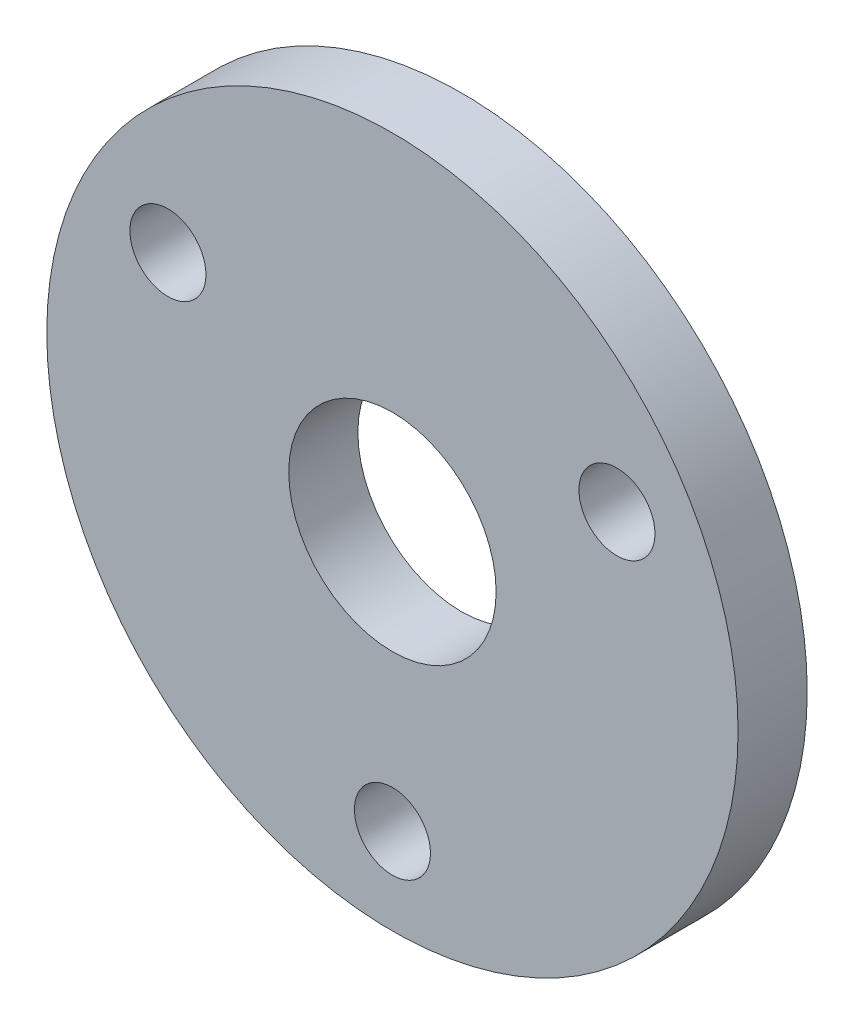
ISO-10303-21;
HEADER;
FILE_DESCRIPTION(('STEP AP214'),'2;1');
FILE_NAME('part.step','',(''),(''),'','','');
FILE_SCHEMA(('AUTOMOTIVE_DESIGN { 1 0 10303 214 1 1 1 1 }'));
ENDSEC;
DATA;
#1=APPLICATION_CONTEXT('core data for automotive mechanical design processes');
#2=APPLICATION_PROTOCOL_DEFINITION('international standard','automotive_design',2000,#1);
#3=PRODUCT_CONTEXT('',#1,'mechanical');
#4=PRODUCT('Part','Part','',(#3));
#5=PRODUCT_RELATED_PRODUCT_CATEGORY('part','',(#4));
#6=PRODUCT_DEFINITION_FORMATION('','',#4);
#7=PRODUCT_DEFINITION_CONTEXT('part definition',#1,'design');
#8=PRODUCT_DEFINITION('design','',#6,#7);
#9=PRODUCT_DEFINITION_SHAPE('','',#8);
#10=(LENGTH_UNIT() NAMED_UNIT(*) SI_UNIT(.MILLI.,.METRE.));
#11=(NAMED_UNIT(*) PLANE_ANGLE_UNIT() SI_UNIT($,.RADIAN.));
#12=(NAMED_UNIT(*) SI_UNIT($,.STERADIAN.) SOLID_ANGLE_UNIT());
#13=UNCERTAINTY_MEASURE_WITH_UNIT(LENGTH_MEASURE(1.E-05),#10,'distance_accuracy_value','');
#14=(GEOMETRIC_REPRESENTATION_CONTEXT(3) GLOBAL_UNCERTAINTY_ASSIGNED_CONTEXT((#13)) GLOBAL_UNIT_ASSIGNED_CONTEXT((#10,
#11,#12)) REPRESENTATION_CONTEXT('',''));
#15=CARTESIAN_POINT('',(0.,0.,0.));
#16=DIRECTION('',(0.,0.,1.));
#17=DIRECTION('',(1.,0.,0.));
#18=AXIS2_PLACEMENT_3D('',#15,#16,#17);
#19=CARTESIAN_POINT('',(0.,0.,2.));
#20=DIRECTION('',(0.,0.,1.));
#21=DIRECTION('',(1.,0.,0.));
#22=AXIS2_PLACEMENT_3D('',#19,#20,#21);
#23=PLANE('',#22);
#24=CARTESIAN_POINT('',(-6.49519052838322,3.75000000000012,2.));
#25=DIRECTION('',(0.,0.,1.));
#26=DIRECTION('',(1.,0.,0.));
#27=AXIS2_PLACEMENT_3D('',#24,#25,#26);
#28=CIRCLE('',#27,1.1);
#29=CARTESIAN_POINT('',(-5.39519052838322,3.75000000000012,2.));
#30=VERTEX_POINT('',#29);
#31=EDGE_CURVE('E55',#30,#30,#28,.T.);
#32=ORIENTED_EDGE('',*,*,#31,.F.);
#33=EDGE_LOOP('',(#32));
#34=FACE_BOUND('',#33,.T.);
#35=CARTESIAN_POINT('',(0.,0.,2.));
#36=DIRECTION('',(0.,0.,1.));
#37=DIRECTION('',(1.,0.,0.));
#38=AXIS2_PLACEMENT_3D('',#35,#36,#37);
#39=CIRCLE('',#38,3.);
#40=CARTESIAN_POINT('',(3.,0.,2.));
#41=VERTEX_POINT('',#40);
#42=EDGE_CURVE('E44',#41,#41,#39,.T.);
#43=ORIENTED_EDGE('',*,*,#42,.F.);
#44=EDGE_LOOP('',(#43));
#45=FACE_BOUND('',#44,.T.);
#46=CARTESIAN_POINT('',(0.,0.,2.));
#47=DIRECTION('',(0.,0.,1.));
#48=DIRECTION('',(1.,0.,0.));
#49=AXIS2_PLACEMENT_3D('',#46,#47,#48);
#50=CIRCLE('',#49,10.);
#51=CARTESIAN_POINT('',(10.,0.,2.));
#52=VERTEX_POINT('',#51);
#53=EDGE_CURVE('E10',#52,#52,#50,.T.);
#54=ORIENTED_EDGE('',*,*,#53,.T.);
#55=EDGE_LOOP('',(#54));
#56=FACE_BOUND('',#55,.T.);
#57=CARTESIAN_POINT('',(0.,-7.5,2.));
#58=DIRECTION('',(0.,0.,1.));
#59=DIRECTION('',(1.,0.,0.));
#60=AXIS2_PLACEMENT_3D('',#57,#58,#59);
#61=CIRCLE('',#60,1.1);
#62=CARTESIAN_POINT('',(1.1,-7.5,2.));
#63=VERTEX_POINT('',#62);
#64=EDGE_CURVE('E49',#63,#63,#61,.T.);
#65=ORIENTED_EDGE('',*,*,#64,.F.);
#66=EDGE_LOOP('',(#65));
#67=FACE_BOUND('',#66,.T.);
#68=CARTESIAN_POINT('',(6.49519052838338,3.74999999999985,2.));
#69=DIRECTION('',(0.,0.,1.));
#70=DIRECTION('',(1.,0.,0.));
#71=AXIS2_PLACEMENT_3D('',#68,#69,#70);
#72=CIRCLE('',#71,1.1);
#73=CARTESIAN_POINT('',(7.59519052838338,3.74999999999985,2.));
#74=VERTEX_POINT('',#73);
#75=EDGE_CURVE('E61',#74,#74,#72,.T.);
#76=ORIENTED_EDGE('',*,*,#75,.F.);
#77=EDGE_LOOP('',(#76));
#78=FACE_BOUND('',#77,.T.);
#79=ADVANCED_FACE('F33',(#34,#45,#56,#67,#78),#23,.T.);
#80=CARTESIAN_POINT('',(0.,0.,0.));
#81=DIRECTION('',(0.,0.,1.));
#82=DIRECTION('',(1.,0.,0.));
#83=AXIS2_PLACEMENT_3D('',#80,#81,#82);
#84=PLANE('',#83);
#85=CARTESIAN_POINT('',(0.,0.,0.));
#86=DIRECTION('',(0.,0.,1.));
#87=DIRECTION('',(1.,0.,0.));
#88=AXIS2_PLACEMENT_3D('',#85,#86,#87);
#89=CIRCLE('',#88,10.);
#90=CARTESIAN_POINT('',(10.,0.,0.));
#91=VERTEX_POINT('',#90);
#92=EDGE_CURVE('E37',#91,#91,#89,.T.);
#93=ORIENTED_EDGE('',*,*,#92,.F.);
#94=EDGE_LOOP('',(#93));
#95=FACE_BOUND('',#94,.T.);
#96=CARTESIAN_POINT('',(0.,0.,0.));
#97=DIRECTION('',(0.,0.,1.));
#98=DIRECTION('',(1.,0.,0.));
#99=AXIS2_PLACEMENT_3D('',#96,#97,#98);
#100=CIRCLE('',#99,3.);
#101=CARTESIAN_POINT('',(3.,0.,0.));
#102=VERTEX_POINT('',#101);
#103=EDGE_CURVE('E46',#102,#102,#100,.T.);
#104=ORIENTED_EDGE('',*,*,#103,.T.);
#105=EDGE_LOOP('',(#104));
#106=FACE_BOUND('',#105,.T.);
#107=CARTESIAN_POINT('',(0.,-7.5,0.));
#108=DIRECTION('',(0.,0.,1.));
#109=DIRECTION('',(1.,0.,0.));
#110=AXIS2_PLACEMENT_3D('',#107,#108,#109);
#111=CIRCLE('',#110,1.1);
#112=CARTESIAN_POINT('',(1.1,-7.5,0.));
#113=VERTEX_POINT('',#112);
#114=EDGE_CURVE('E52',#113,#113,#111,.T.);
#115=ORIENTED_EDGE('',*,*,#114,.T.);
#116=EDGE_LOOP('',(#115));
#117=FACE_BOUND('',#116,.T.);
#118=CARTESIAN_POINT('',(-6.49519052838322,3.75000000000012,0.));
#119=DIRECTION('',(0.,0.,1.));
#120=DIRECTION('',(1.,0.,0.));
#121=AXIS2_PLACEMENT_3D('',#118,#119,#120);
#122=CIRCLE('',#121,1.1);
#123=CARTESIAN_POINT('',(-5.39519052838322,3.75000000000012,0.));
#124=VERTEX_POINT('',#123);
#125=EDGE_CURVE('E58',#124,#124,#122,.T.);
#126=ORIENTED_EDGE('',*,*,#125,.T.);
#127=EDGE_LOOP('',(#126));
#128=FACE_BOUND('',#127,.T.);
#129=CARTESIAN_POINT('',(6.49519052838338,3.74999999999985,0.));
#130=DIRECTION('',(0.,0.,1.));
#131=DIRECTION('',(1.,0.,0.));
#132=AXIS2_PLACEMENT_3D('',#129,#130,#131);
#133=CIRCLE('',#132,1.1);
#134=CARTESIAN_POINT('',(7.59519052838338,3.74999999999985,0.));
#135=VERTEX_POINT('',#134);
#136=EDGE_CURVE('E64',#135,#135,#133,.T.);
#137=ORIENTED_EDGE('',*,*,#136,.T.);
#138=EDGE_LOOP('',(#137));
#139=FACE_BOUND('',#138,.T.);
#140=ADVANCED_FACE('F74',(#95,#106,#117,#128,#139),#84,.F.);
#141=CARTESIAN_POINT('',(0.,0.,2.));
#142=DIRECTION('',(0.,0.,-1.));
#143=DIRECTION('',(-1.,0.,0.));
#144=AXIS2_PLACEMENT_3D('',#141,#142,#143);
#145=CYLINDRICAL_SURFACE('',#144,10.);
#146=ORIENTED_EDGE('',*,*,#53,.F.);
#147=EDGE_LOOP('',(#146));
#148=FACE_BOUND('',#147,.T.);
#149=ORIENTED_EDGE('',*,*,#92,.T.);
#150=EDGE_LOOP('',(#149));
#151=FACE_BOUND('',#150,.T.);
#152=ADVANCED_FACE('F35',(#148,#151),#145,.T.);
#153=CARTESIAN_POINT('',(0.,0.,2.));
#154=DIRECTION('',(0.,0.,-1.));
#155=DIRECTION('',(-1.,0.,0.));
#156=AXIS2_PLACEMENT_3D('',#153,#154,#155);
#157=CYLINDRICAL_SURFACE('',#156,3.);
#158=ORIENTED_EDGE('',*,*,#42,.T.);
#159=EDGE_LOOP('',(#158));
#160=FACE_BOUND('',#159,.T.);
#161=ORIENTED_EDGE('',*,*,#103,.F.);
#162=EDGE_LOOP('',(#161));
#163=FACE_BOUND('',#162,.T.);
#164=ADVANCED_FACE('F84',(#160,#163),#157,.F.);
#165=CARTESIAN_POINT('',(0.,-7.5,2.));
#166=DIRECTION('',(0.,0.,-1.));
#167=DIRECTION('',(-1.,0.,0.));
#168=AXIS2_PLACEMENT_3D('',#165,#166,#167);
#169=CYLINDRICAL_SURFACE('',#168,1.1);
#170=ORIENTED_EDGE('',*,*,#64,.T.);
#171=EDGE_LOOP('',(#170));
#172=FACE_BOUND('',#171,.T.);
#173=ORIENTED_EDGE('',*,*,#114,.F.);
#174=EDGE_LOOP('',(#173));
#175=FACE_BOUND('',#174,.T.);
#176=ADVANCED_FACE('F87',(#172,#175),#169,.F.);
#177=CARTESIAN_POINT('',(-6.49519052838322,3.75000000000012,2.));
#178=DIRECTION('',(0.,0.,-1.));
#179=DIRECTION('',(-1.,0.,0.));
#180=AXIS2_PLACEMENT_3D('',#177,#178,#179);
#181=CYLINDRICAL_SURFACE('',#180,1.1);
#182=ORIENTED_EDGE('',*,*,#31,.T.);
#183=EDGE_LOOP('',(#182));
#184=FACE_BOUND('',#183,.T.);
#185=ORIENTED_EDGE('',*,*,#125,.F.);
#186=EDGE_LOOP('',(#185));
#187=FACE_BOUND('',#186,.T.);
#188=ADVANCED_FACE('F91',(#184,#187),#181,.F.);
#189=CARTESIAN_POINT('',(6.49519052838338,3.74999999999985,2.));
#190=DIRECTION('',(0.,0.,-1.));
#191=DIRECTION('',(-1.,0.,0.));
#192=AXIS2_PLACEMENT_3D('',#189,#190,#191);
#193=CYLINDRICAL_SURFACE('',#192,1.1);
#194=ORIENTED_EDGE('',*,*,#75,.T.);
#195=EDGE_LOOP('',(#194));
#196=FACE_BOUND('',#195,.T.);
#197=ORIENTED_EDGE('',*,*,#136,.F.);
#198=EDGE_LOOP('',(#197));
#199=FACE_BOUND('',#198,.T.);
#200=ADVANCED_FACE('F70',(#196,#199),#193,.F.);
#201=CLOSED_SHELL('',(#79,#140,#152,#164,#176,#188,#200));
#202=MANIFOLD_SOLID_BREP('B2',#201);
#203=ADVANCED_BREP_SHAPE_REPRESENTATION('',(#18,#202),#14);
#204=SHAPE_DEFINITION_REPRESENTATION(#9,#203);
ENDSEC;
END-ISO-10303-21;
